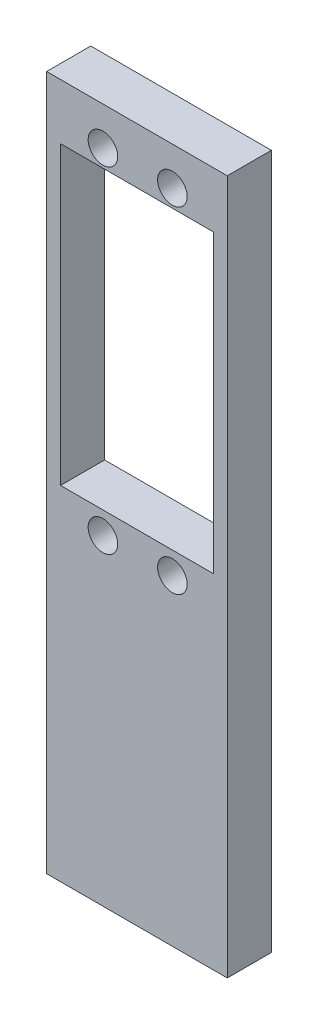
ISO-10303-21;
HEADER;
FILE_DESCRIPTION(('STEP AP214'),'2;1');
FILE_NAME('part.step','',(''),(''),'','','');
FILE_SCHEMA(('AUTOMOTIVE_DESIGN { 1 0 10303 214 1 1 1 1 }'));
ENDSEC;
DATA;
#1=APPLICATION_CONTEXT('core data for automotive mechanical design processes');
#2=APPLICATION_PROTOCOL_DEFINITION('international standard','automotive_design',2000,#1);
#3=PRODUCT_CONTEXT('',#1,'mechanical');
#4=PRODUCT('Part','Part','',(#3));
#5=PRODUCT_RELATED_PRODUCT_CATEGORY('part','',(#4));
#6=PRODUCT_DEFINITION_FORMATION('','',#4);
#7=PRODUCT_DEFINITION_CONTEXT('part definition',#1,'design');
#8=PRODUCT_DEFINITION('design','',#6,#7);
#9=PRODUCT_DEFINITION_SHAPE('','',#8);
#10=(LENGTH_UNIT() NAMED_UNIT(*) SI_UNIT(.MILLI.,.METRE.));
#11=(NAMED_UNIT(*) PLANE_ANGLE_UNIT() SI_UNIT($,.RADIAN.));
#12=(NAMED_UNIT(*) SI_UNIT($,.STERADIAN.) SOLID_ANGLE_UNIT());
#13=UNCERTAINTY_MEASURE_WITH_UNIT(LENGTH_MEASURE(1.E-05),#10,'distance_accuracy_value','');
#14=(GEOMETRIC_REPRESENTATION_CONTEXT(3) GLOBAL_UNCERTAINTY_ASSIGNED_CONTEXT((#13)) GLOBAL_UNIT_ASSIGNED_CONTEXT((#10,
#11,#12)) REPRESENTATION_CONTEXT('',''));
#15=CARTESIAN_POINT('',(0.,0.,0.));
#16=DIRECTION('',(0.,0.,1.));
#17=DIRECTION('',(1.,0.,0.));
#18=AXIS2_PLACEMENT_3D('',#15,#16,#17);
#19=CARTESIAN_POINT('',(-1.32527024895831,-21.2506700204016,0.952957558795939));
#20=DIRECTION('',(-1.,0.,0.));
#21=DIRECTION('',(0.,0.,1.));
#22=AXIS2_PLACEMENT_3D('',#19,#20,#21);
#23=PLANE('',#22);
#24=DIRECTION('',(0.,-1.,0.));
#25=VECTOR('',#24,1.);
#26=CARTESIAN_POINT('',(-1.32527024895831,-21.2506700204016,7.30295755879594));
#27=LINE('',#26,#25);
#28=CARTESIAN_POINT('',(-1.32527024895831,78.7493299795984,7.30295755879594));
#29=VERTEX_POINT('',#28);
#30=CARTESIAN_POINT('',(-1.32527024895831,-21.2506700204016,7.30295755879594));
#31=VERTEX_POINT('',#30);
#32=EDGE_CURVE('E132',#29,#31,#27,.T.);
#33=ORIENTED_EDGE('',*,*,#32,.T.);
#34=DIRECTION('',(0.,0.,1.));
#35=VECTOR('',#34,1.);
#36=CARTESIAN_POINT('',(-1.32527024895831,-21.2506700204016,0.952957558795939));
#37=LINE('',#36,#35);
#38=CARTESIAN_POINT('',(-1.32527024895831,-21.2506700204016,0.952957558795939));
#39=VERTEX_POINT('',#38);
#40=EDGE_CURVE('E11',#39,#31,#37,.T.);
#41=ORIENTED_EDGE('',*,*,#40,.F.);
#42=DIRECTION('',(0.,-1.,0.));
#43=VECTOR('',#42,1.);
#44=CARTESIAN_POINT('',(-1.32527024895831,-21.2506700204016,0.952957558795939));
#45=LINE('',#44,#43);
#46=CARTESIAN_POINT('',(-1.32527024895831,78.7493299795984,0.952957558795939));
#47=VERTEX_POINT('',#46);
#48=EDGE_CURVE('E136',#47,#39,#45,.T.);
#49=ORIENTED_EDGE('',*,*,#48,.F.);
#50=DIRECTION('',(0.,0.,1.));
#51=VECTOR('',#50,1.);
#52=CARTESIAN_POINT('',(-1.32527024895831,78.7493299795984,0.952957558795939));
#53=LINE('',#52,#51);
#54=EDGE_CURVE('E146',#47,#29,#53,.T.);
#55=ORIENTED_EDGE('',*,*,#54,.T.);
#56=EDGE_LOOP('',(#33,#41,#49,#55));
#57=FACE_BOUND('',#56,.T.);
#58=ADVANCED_FACE('F32',(#57),#23,.F.);
#59=CARTESIAN_POINT('',(-1.32527024895831,-21.2506700204016,0.952957558795939));
#60=DIRECTION('',(0.,1.,0.));
#61=DIRECTION('',(0.,0.,1.));
#62=AXIS2_PLACEMENT_3D('',#59,#60,#61);
#63=PLANE('',#62);
#64=DIRECTION('',(-1.,0.,0.));
#65=VECTOR('',#64,1.);
#66=CARTESIAN_POINT('',(-1.32527024895831,-21.2506700204016,7.30295755879594));
#67=LINE('',#66,#65);
#68=CARTESIAN_POINT('',(-27.3252702489583,-21.2506700204016,7.30295755879594));
#69=VERTEX_POINT('',#68);
#70=EDGE_CURVE('E149',#31,#69,#67,.T.);
#71=ORIENTED_EDGE('',*,*,#70,.T.);
#72=DIRECTION('',(0.,0.,1.));
#73=VECTOR('',#72,1.);
#74=CARTESIAN_POINT('',(-27.3252702489583,-21.2506700204016,0.952957558795939));
#75=LINE('',#74,#73);
#76=CARTESIAN_POINT('',(-27.3252702489583,-21.2506700204016,0.952957558795939));
#77=VERTEX_POINT('',#76);
#78=EDGE_CURVE('E39',#77,#69,#75,.T.);
#79=ORIENTED_EDGE('',*,*,#78,.F.);
#80=DIRECTION('',(-1.,0.,0.));
#81=VECTOR('',#80,1.);
#82=CARTESIAN_POINT('',(-1.32527024895831,-21.2506700204016,0.952957558795939));
#83=LINE('',#82,#81);
#84=EDGE_CURVE('E139',#39,#77,#83,.T.);
#85=ORIENTED_EDGE('',*,*,#84,.F.);
#86=ORIENTED_EDGE('',*,*,#40,.T.);
#87=EDGE_LOOP('',(#71,#79,#85,#86));
#88=FACE_BOUND('',#87,.T.);
#89=ADVANCED_FACE('F177',(#88),#63,.F.);
#90=CARTESIAN_POINT('',(-27.3252702489583,-21.2506700204016,0.952957558795939));
#91=DIRECTION('',(1.,0.,0.));
#92=DIRECTION('',(0.,0.,-1.));
#93=AXIS2_PLACEMENT_3D('',#90,#91,#92);
#94=PLANE('',#93);
#95=DIRECTION('',(0.,1.,0.));
#96=VECTOR('',#95,1.);
#97=CARTESIAN_POINT('',(-27.3252702489583,-21.2506700204016,7.30295755879594));
#98=LINE('',#97,#96);
#99=CARTESIAN_POINT('',(-27.3252702489583,78.7493299795984,7.30295755879594));
#100=VERTEX_POINT('',#99);
#101=EDGE_CURVE('E151',#69,#100,#98,.T.);
#102=ORIENTED_EDGE('',*,*,#101,.T.);
#103=DIRECTION('',(0.,0.,1.));
#104=VECTOR('',#103,1.);
#105=CARTESIAN_POINT('',(-27.3252702489583,78.7493299795984,0.952957558795939));
#106=LINE('',#105,#104);
#107=CARTESIAN_POINT('',(-27.3252702489583,78.7493299795984,0.952957558795939));
#108=VERTEX_POINT('',#107);
#109=EDGE_CURVE('E156',#108,#100,#106,.T.);
#110=ORIENTED_EDGE('',*,*,#109,.F.);
#111=DIRECTION('',(0.,1.,0.));
#112=VECTOR('',#111,1.);
#113=CARTESIAN_POINT('',(-27.3252702489583,-21.2506700204016,0.952957558795939));
#114=LINE('',#113,#112);
#115=EDGE_CURVE('E142',#77,#108,#114,.T.);
#116=ORIENTED_EDGE('',*,*,#115,.F.);
#117=ORIENTED_EDGE('',*,*,#78,.T.);
#118=EDGE_LOOP('',(#102,#110,#116,#117));
#119=FACE_BOUND('',#118,.T.);
#120=ADVANCED_FACE('F163',(#119),#94,.F.);
#121=CARTESIAN_POINT('',(-1.32527024895831,78.7493299795984,0.952957558795939));
#122=DIRECTION('',(0.,-1.,0.));
#123=DIRECTION('',(0.,0.,-1.));
#124=AXIS2_PLACEMENT_3D('',#121,#122,#123);
#125=PLANE('',#124);
#126=DIRECTION('',(1.,0.,0.));
#127=VECTOR('',#126,1.);
#128=CARTESIAN_POINT('',(-1.32527024895831,78.7493299795984,7.30295755879594));
#129=LINE('',#128,#127);
#130=EDGE_CURVE('E140',#100,#29,#129,.T.);
#131=ORIENTED_EDGE('',*,*,#130,.T.);
#132=ORIENTED_EDGE('',*,*,#54,.F.);
#133=DIRECTION('',(1.,0.,0.));
#134=VECTOR('',#133,1.);
#135=CARTESIAN_POINT('',(-1.32527024895831,78.7493299795984,0.952957558795939));
#136=LINE('',#135,#134);
#137=EDGE_CURVE('E144',#108,#47,#136,.T.);
#138=ORIENTED_EDGE('',*,*,#137,.F.);
#139=ORIENTED_EDGE('',*,*,#109,.T.);
#140=EDGE_LOOP('',(#131,#132,#138,#139));
#141=FACE_BOUND('',#140,.T.);
#142=ADVANCED_FACE('F170',(#141),#125,.F.);
#143=CARTESIAN_POINT('',(0.,0.,0.952957558795939));
#144=DIRECTION('',(0.,0.,1.));
#145=DIRECTION('',(1.,0.,0.));
#146=AXIS2_PLACEMENT_3D('',#143,#144,#145);
#147=PLANE('',#146);
#148=CARTESIAN_POINT('',(-19.2252702489583,73.2493299795984,0.952957558795939));
#149=DIRECTION('',(0.,0.,1.));
#150=DIRECTION('',(1.,0.,0.));
#151=AXIS2_PLACEMENT_3D('',#148,#149,#150);
#152=CIRCLE('',#151,2.12500000000001);
#153=CARTESIAN_POINT('',(-17.1002702489583,73.2493299795984,0.952957558795939));
#154=VERTEX_POINT('',#153);
#155=EDGE_CURVE('E224',#154,#154,#152,.T.);
#156=ORIENTED_EDGE('',*,*,#155,.T.);
#157=EDGE_LOOP('',(#156));
#158=FACE_BOUND('',#157,.T.);
#159=CARTESIAN_POINT('',(-9.22527024895831,73.2493299795984,0.952957558795939));
#160=DIRECTION('',(0.,0.,1.));
#161=DIRECTION('',(1.,0.,0.));
#162=AXIS2_PLACEMENT_3D('',#159,#160,#161);
#163=CIRCLE('',#162,2.12500000000001);
#164=CARTESIAN_POINT('',(-7.1002702489583,73.2493299795984,0.952957558795939));
#165=VERTEX_POINT('',#164);
#166=EDGE_CURVE('E234',#165,#165,#163,.T.);
#167=ORIENTED_EDGE('',*,*,#166,.T.);
#168=EDGE_LOOP('',(#167));
#169=FACE_BOUND('',#168,.T.);
#170=CARTESIAN_POINT('',(-19.2252702489583,24.9493299795984,0.952957558795939));
#171=DIRECTION('',(0.,0.,1.));
#172=DIRECTION('',(1.,0.,0.));
#173=AXIS2_PLACEMENT_3D('',#170,#171,#172);
#174=CIRCLE('',#173,2.12500000000001);
#175=CARTESIAN_POINT('',(-17.1002702489583,24.9493299795984,0.952957558795939));
#176=VERTEX_POINT('',#175);
#177=EDGE_CURVE('E240',#176,#176,#174,.T.);
#178=ORIENTED_EDGE('',*,*,#177,.T.);
#179=EDGE_LOOP('',(#178));
#180=FACE_BOUND('',#179,.T.);
#181=CARTESIAN_POINT('',(-9.22527024895831,24.9493299795984,0.952957558795939));
#182=DIRECTION('',(0.,0.,1.));
#183=DIRECTION('',(1.,0.,0.));
#184=AXIS2_PLACEMENT_3D('',#181,#182,#183);
#185=CIRCLE('',#184,2.12500000000001);
#186=CARTESIAN_POINT('',(-7.1002702489583,24.9493299795984,0.952957558795939));
#187=VERTEX_POINT('',#186);
#188=EDGE_CURVE('E120',#187,#187,#185,.T.);
#189=ORIENTED_EDGE('',*,*,#188,.T.);
#190=EDGE_LOOP('',(#189));
#191=FACE_BOUND('',#190,.T.);
#192=DIRECTION('',(1.,0.,0.));
#193=VECTOR('',#192,1.);
#194=CARTESIAN_POINT('',(-25.3252702489583,70.7493299795984,0.952957558795939));
#195=LINE('',#194,#193);
#196=CARTESIAN_POINT('',(-25.3252702489583,70.7493299795984,0.952957558795939));
#197=VERTEX_POINT('',#196);
#198=CARTESIAN_POINT('',(-3.32527024895831,70.7493299795984,0.952957558795939));
#199=VERTEX_POINT('',#198);
#200=EDGE_CURVE('E126',#197,#199,#195,.T.);
#201=ORIENTED_EDGE('',*,*,#200,.F.);
#202=DIRECTION('',(0.,1.,0.));
#203=VECTOR('',#202,1.);
#204=CARTESIAN_POINT('',(-25.3252702489583,70.7493299795984,0.952957558795939));
#205=LINE('',#204,#203);
#206=CARTESIAN_POINT('',(-25.3252702489583,28.1493299795984,0.952957558795939));
#207=VERTEX_POINT('',#206);
#208=EDGE_CURVE('E46',#207,#197,#205,.T.);
#209=ORIENTED_EDGE('',*,*,#208,.F.);
#210=DIRECTION('',(-1.,0.,0.));
#211=VECTOR('',#210,1.);
#212=CARTESIAN_POINT('',(-25.3252702489583,28.1493299795984,0.952957558795939));
#213=LINE('',#212,#211);
#214=CARTESIAN_POINT('',(-3.32527024895832,28.1493299795984,0.952957558795939));
#215=VERTEX_POINT('',#214);
#216=EDGE_CURVE('E114',#215,#207,#213,.T.);
#217=ORIENTED_EDGE('',*,*,#216,.F.);
#218=DIRECTION('',(0.,-1.,0.));
#219=VECTOR('',#218,1.);
#220=CARTESIAN_POINT('',(-3.32527024895831,70.7493299795984,0.952957558795939));
#221=LINE('',#220,#219);
#222=EDGE_CURVE('E117',#199,#215,#221,.T.);
#223=ORIENTED_EDGE('',*,*,#222,.F.);
#224=EDGE_LOOP('',(#201,#209,#217,#223));
#225=FACE_BOUND('',#224,.T.);
#226=ORIENTED_EDGE('',*,*,#48,.T.);
#227=ORIENTED_EDGE('',*,*,#84,.T.);
#228=ORIENTED_EDGE('',*,*,#115,.T.);
#229=ORIENTED_EDGE('',*,*,#137,.T.);
#230=EDGE_LOOP('',(#226,#227,#228,#229));
#231=FACE_BOUND('',#230,.T.);
#232=ADVANCED_FACE('F176',(#158,#169,#180,#191,#225,#231),#147,.F.);
#233=CARTESIAN_POINT('',(0.,0.,7.30295755879594));
#234=DIRECTION('',(0.,0.,1.));
#235=DIRECTION('',(1.,0.,0.));
#236=AXIS2_PLACEMENT_3D('',#233,#234,#235);
#237=PLANE('',#236);
#238=CARTESIAN_POINT('',(-19.2252702489583,73.2493299795984,7.30295755879594));
#239=DIRECTION('',(0.,0.,1.));
#240=DIRECTION('',(1.,0.,0.));
#241=AXIS2_PLACEMENT_3D('',#238,#239,#240);
#242=CIRCLE('',#241,2.12500000000001);
#243=CARTESIAN_POINT('',(-17.1002702489583,73.2493299795984,7.30295755879594));
#244=VERTEX_POINT('',#243);
#245=EDGE_CURVE('E227',#244,#244,#242,.T.);
#246=ORIENTED_EDGE('',*,*,#245,.F.);
#247=EDGE_LOOP('',(#246));
#248=FACE_BOUND('',#247,.T.);
#249=CARTESIAN_POINT('',(-9.22527024895831,73.2493299795984,7.30295755879594));
#250=DIRECTION('',(0.,0.,1.));
#251=DIRECTION('',(1.,0.,0.));
#252=AXIS2_PLACEMENT_3D('',#249,#250,#251);
#253=CIRCLE('',#252,2.12500000000001);
#254=CARTESIAN_POINT('',(-7.1002702489583,73.2493299795984,7.30295755879594));
#255=VERTEX_POINT('',#254);
#256=EDGE_CURVE('E229',#255,#255,#253,.T.);
#257=ORIENTED_EDGE('',*,*,#256,.F.);
#258=EDGE_LOOP('',(#257));
#259=FACE_BOUND('',#258,.T.);
#260=CARTESIAN_POINT('',(-19.2252702489583,24.9493299795984,7.30295755879594));
#261=DIRECTION('',(0.,0.,1.));
#262=DIRECTION('',(1.,0.,0.));
#263=AXIS2_PLACEMENT_3D('',#260,#261,#262);
#264=CIRCLE('',#263,2.12500000000001);
#265=CARTESIAN_POINT('',(-17.1002702489583,24.9493299795984,7.30295755879594));
#266=VERTEX_POINT('',#265);
#267=EDGE_CURVE('E237',#266,#266,#264,.T.);
#268=ORIENTED_EDGE('',*,*,#267,.F.);
#269=EDGE_LOOP('',(#268));
#270=FACE_BOUND('',#269,.T.);
#271=CARTESIAN_POINT('',(-9.22527024895831,24.9493299795984,7.30295755879594));
#272=DIRECTION('',(0.,0.,1.));
#273=DIRECTION('',(1.,0.,0.));
#274=AXIS2_PLACEMENT_3D('',#271,#272,#273);
#275=CIRCLE('',#274,2.12500000000001);
#276=CARTESIAN_POINT('',(-7.1002702489583,24.9493299795984,7.30295755879594));
#277=VERTEX_POINT('',#276);
#278=EDGE_CURVE('E242',#277,#277,#275,.T.);
#279=ORIENTED_EDGE('',*,*,#278,.F.);
#280=EDGE_LOOP('',(#279));
#281=FACE_BOUND('',#280,.T.);
#282=DIRECTION('',(0.,1.,0.));
#283=VECTOR('',#282,1.);
#284=CARTESIAN_POINT('',(-25.3252702489583,70.7493299795984,7.30295755879594));
#285=LINE('',#284,#283);
#286=CARTESIAN_POINT('',(-25.3252702489583,28.1493299795984,7.30295755879594));
#287=VERTEX_POINT('',#286);
#288=CARTESIAN_POINT('',(-25.3252702489583,70.7493299795984,7.30295755879594));
#289=VERTEX_POINT('',#288);
#290=EDGE_CURVE('E98',#287,#289,#285,.T.);
#291=ORIENTED_EDGE('',*,*,#290,.T.);
#292=DIRECTION('',(1.,0.,0.));
#293=VECTOR('',#292,1.);
#294=CARTESIAN_POINT('',(-25.3252702489583,70.7493299795984,7.30295755879594));
#295=LINE('',#294,#293);
#296=CARTESIAN_POINT('',(-3.32527024895831,70.7493299795984,7.30295755879594));
#297=VERTEX_POINT('',#296);
#298=EDGE_CURVE('E107',#289,#297,#295,.T.);
#299=ORIENTED_EDGE('',*,*,#298,.T.);
#300=DIRECTION('',(0.,-1.,0.));
#301=VECTOR('',#300,1.);
#302=CARTESIAN_POINT('',(-3.32527024895831,70.7493299795984,7.30295755879594));
#303=LINE('',#302,#301);
#304=CARTESIAN_POINT('',(-3.32527024895832,28.1493299795984,7.30295755879594));
#305=VERTEX_POINT('',#304);
#306=EDGE_CURVE('E54',#297,#305,#303,.T.);
#307=ORIENTED_EDGE('',*,*,#306,.T.);
#308=DIRECTION('',(-1.,0.,0.));
#309=VECTOR('',#308,1.);
#310=CARTESIAN_POINT('',(-25.3252702489583,28.1493299795984,7.30295755879594));
#311=LINE('',#310,#309);
#312=EDGE_CURVE('E104',#305,#287,#311,.T.);
#313=ORIENTED_EDGE('',*,*,#312,.T.);
#314=EDGE_LOOP('',(#291,#299,#307,#313));
#315=FACE_BOUND('',#314,.T.);
#316=ORIENTED_EDGE('',*,*,#32,.F.);
#317=ORIENTED_EDGE('',*,*,#130,.F.);
#318=ORIENTED_EDGE('',*,*,#101,.F.);
#319=ORIENTED_EDGE('',*,*,#70,.F.);
#320=EDGE_LOOP('',(#316,#317,#318,#319));
#321=FACE_BOUND('',#320,.T.);
#322=ADVANCED_FACE('F111',(#248,#259,#270,#281,#315,#321),#237,.T.);
#323=CARTESIAN_POINT('',(-25.3252702489583,70.7493299795984,7.30295755879594));
#324=DIRECTION('',(-1.,0.,0.));
#325=DIRECTION('',(0.,-1.,0.));
#326=AXIS2_PLACEMENT_3D('',#323,#324,#325);
#327=PLANE('',#326);
#328=ORIENTED_EDGE('',*,*,#208,.T.);
#329=DIRECTION('',(0.,0.,-1.));
#330=VECTOR('',#329,1.);
#331=CARTESIAN_POINT('',(-25.3252702489583,70.7493299795984,7.30295755879594));
#332=LINE('',#331,#330);
#333=EDGE_CURVE('E94',#289,#197,#332,.T.);
#334=ORIENTED_EDGE('',*,*,#333,.F.);
#335=ORIENTED_EDGE('',*,*,#290,.F.);
#336=DIRECTION('',(0.,0.,-1.));
#337=VECTOR('',#336,1.);
#338=CARTESIAN_POINT('',(-25.3252702489583,28.1493299795984,7.30295755879594));
#339=LINE('',#338,#337);
#340=EDGE_CURVE('E130',#287,#207,#339,.T.);
#341=ORIENTED_EDGE('',*,*,#340,.T.);
#342=EDGE_LOOP('',(#328,#334,#335,#341));
#343=FACE_BOUND('',#342,.T.);
#344=ADVANCED_FACE('F96',(#343),#327,.F.);
#345=CARTESIAN_POINT('',(-25.3252702489583,28.1493299795984,7.30295755879594));
#346=DIRECTION('',(0.,-1.,0.));
#347=DIRECTION('',(0.,0.,-1.));
#348=AXIS2_PLACEMENT_3D('',#345,#346,#347);
#349=PLANE('',#348);
#350=ORIENTED_EDGE('',*,*,#216,.T.);
#351=ORIENTED_EDGE('',*,*,#340,.F.);
#352=ORIENTED_EDGE('',*,*,#312,.F.);
#353=DIRECTION('',(0.,0.,-1.));
#354=VECTOR('',#353,1.);
#355=CARTESIAN_POINT('',(-3.32527024895832,28.1493299795984,7.30295755879594));
#356=LINE('',#355,#354);
#357=EDGE_CURVE('E133',#305,#215,#356,.T.);
#358=ORIENTED_EDGE('',*,*,#357,.T.);
#359=EDGE_LOOP('',(#350,#351,#352,#358));
#360=FACE_BOUND('',#359,.T.);
#361=ADVANCED_FACE('F195',(#360),#349,.F.);
#362=CARTESIAN_POINT('',(-3.32527024895831,70.7493299795984,7.30295755879594));
#363=DIRECTION('',(1.,0.,0.));
#364=DIRECTION('',(0.,1.,0.));
#365=AXIS2_PLACEMENT_3D('',#362,#363,#364);
#366=PLANE('',#365);
#367=ORIENTED_EDGE('',*,*,#222,.T.);
#368=ORIENTED_EDGE('',*,*,#357,.F.);
#369=ORIENTED_EDGE('',*,*,#306,.F.);
#370=DIRECTION('',(0.,0.,-1.));
#371=VECTOR('',#370,1.);
#372=CARTESIAN_POINT('',(-3.32527024895831,70.7493299795984,7.30295755879594));
#373=LINE('',#372,#371);
#374=EDGE_CURVE('E103',#297,#199,#373,.T.);
#375=ORIENTED_EDGE('',*,*,#374,.T.);
#376=EDGE_LOOP('',(#367,#368,#369,#375));
#377=FACE_BOUND('',#376,.T.);
#378=ADVANCED_FACE('F199',(#377),#366,.F.);
#379=CARTESIAN_POINT('',(-25.3252702489583,70.7493299795984,7.30295755879594));
#380=DIRECTION('',(0.,1.,0.));
#381=DIRECTION('',(0.,0.,1.));
#382=AXIS2_PLACEMENT_3D('',#379,#380,#381);
#383=PLANE('',#382);
#384=ORIENTED_EDGE('',*,*,#200,.T.);
#385=ORIENTED_EDGE('',*,*,#374,.F.);
#386=ORIENTED_EDGE('',*,*,#298,.F.);
#387=ORIENTED_EDGE('',*,*,#333,.T.);
#388=EDGE_LOOP('',(#384,#385,#386,#387));
#389=FACE_BOUND('',#388,.T.);
#390=ADVANCED_FACE('F108',(#389),#383,.F.);
#391=CARTESIAN_POINT('',(-9.22527024895831,24.9493299795984,7.30295755879594));
#392=DIRECTION('',(0.,0.,1.));
#393=DIRECTION('',(1.,0.,0.));
#394=AXIS2_PLACEMENT_3D('',#391,#392,#393);
#395=CYLINDRICAL_SURFACE('',#394,2.12500000000001);
#396=ORIENTED_EDGE('',*,*,#188,.F.);
#397=EDGE_LOOP('',(#396));
#398=FACE_BOUND('',#397,.T.);
#399=ORIENTED_EDGE('',*,*,#278,.T.);
#400=EDGE_LOOP('',(#399));
#401=FACE_BOUND('',#400,.T.);
#402=ADVANCED_FACE('F198',(#398,#401),#395,.F.);
#403=CARTESIAN_POINT('',(-19.2252702489583,24.9493299795984,7.30295755879594));
#404=DIRECTION('',(0.,0.,1.));
#405=DIRECTION('',(1.,0.,0.));
#406=AXIS2_PLACEMENT_3D('',#403,#404,#405);
#407=CYLINDRICAL_SURFACE('',#406,2.12500000000001);
#408=ORIENTED_EDGE('',*,*,#177,.F.);
#409=EDGE_LOOP('',(#408));
#410=FACE_BOUND('',#409,.T.);
#411=ORIENTED_EDGE('',*,*,#267,.T.);
#412=EDGE_LOOP('',(#411));
#413=FACE_BOUND('',#412,.T.);
#414=ADVANCED_FACE('F207',(#410,#413),#407,.F.);
#415=CARTESIAN_POINT('',(-9.22527024895831,73.2493299795984,7.30295755879594));
#416=DIRECTION('',(0.,0.,1.));
#417=DIRECTION('',(1.,0.,0.));
#418=AXIS2_PLACEMENT_3D('',#415,#416,#417);
#419=CYLINDRICAL_SURFACE('',#418,2.12500000000001);
#420=ORIENTED_EDGE('',*,*,#166,.F.);
#421=EDGE_LOOP('',(#420));
#422=FACE_BOUND('',#421,.T.);
#423=ORIENTED_EDGE('',*,*,#256,.T.);
#424=EDGE_LOOP('',(#423));
#425=FACE_BOUND('',#424,.T.);
#426=ADVANCED_FACE('F211',(#422,#425),#419,.F.);
#427=CARTESIAN_POINT('',(-19.2252702489583,73.2493299795984,7.30295755879594));
#428=DIRECTION('',(0.,0.,1.));
#429=DIRECTION('',(1.,0.,0.));
#430=AXIS2_PLACEMENT_3D('',#427,#428,#429);
#431=CYLINDRICAL_SURFACE('',#430,2.12500000000001);
#432=ORIENTED_EDGE('',*,*,#155,.F.);
#433=EDGE_LOOP('',(#432));
#434=FACE_BOUND('',#433,.T.);
#435=ORIENTED_EDGE('',*,*,#245,.T.);
#436=EDGE_LOOP('',(#435));
#437=FACE_BOUND('',#436,.T.);
#438=ADVANCED_FACE('F215',(#434,#437),#431,.F.);
#439=CLOSED_SHELL('',(#58,#89,#120,#142,#232,#322,#344,#361,#378,#390,#402,#414,#426,#438));
#440=MANIFOLD_SOLID_BREP('B2',#439);
#441=ADVANCED_BREP_SHAPE_REPRESENTATION('',(#18,#440),#14);
#442=SHAPE_DEFINITION_REPRESENTATION(#9,#441);
ENDSEC;
END-ISO-10303-21;
